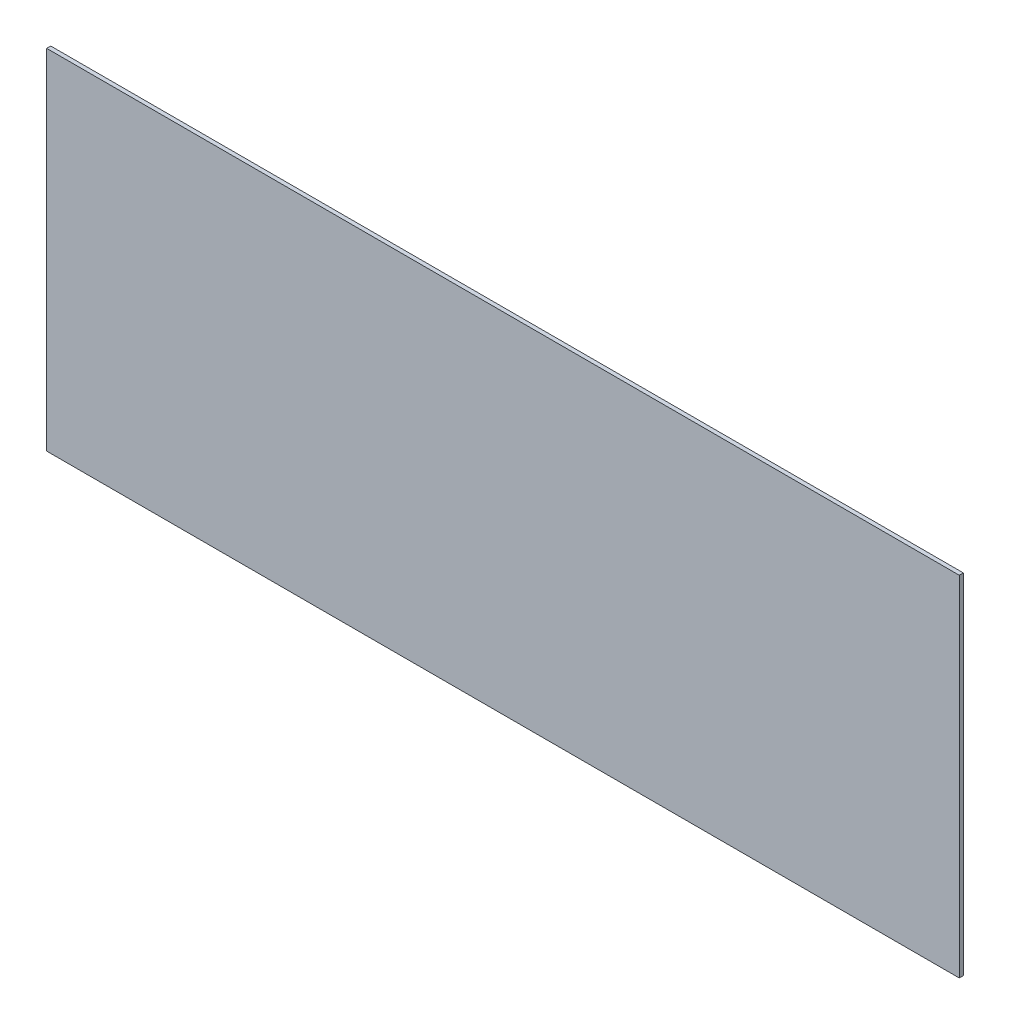
ISO-10303-21;
HEADER;
FILE_DESCRIPTION(('STEP AP214'),'2;1');
FILE_NAME('part.step','',(''),(''),'','','');
FILE_SCHEMA(('AUTOMOTIVE_DESIGN { 1 0 10303 214 1 1 1 1 }'));
ENDSEC;
DATA;
#1=APPLICATION_CONTEXT('core data for automotive mechanical design processes');
#2=APPLICATION_PROTOCOL_DEFINITION('international standard','automotive_design',2000,#1);
#3=PRODUCT_CONTEXT('',#1,'mechanical');
#4=PRODUCT('Part','Part','',(#3));
#5=PRODUCT_RELATED_PRODUCT_CATEGORY('part','',(#4));
#6=PRODUCT_DEFINITION_FORMATION('','',#4);
#7=PRODUCT_DEFINITION_CONTEXT('part definition',#1,'design');
#8=PRODUCT_DEFINITION('design','',#6,#7);
#9=PRODUCT_DEFINITION_SHAPE('','',#8);
#10=(LENGTH_UNIT() NAMED_UNIT(*) SI_UNIT(.MILLI.,.METRE.));
#11=(NAMED_UNIT(*) PLANE_ANGLE_UNIT() SI_UNIT($,.RADIAN.));
#12=(NAMED_UNIT(*) SI_UNIT($,.STERADIAN.) SOLID_ANGLE_UNIT());
#13=UNCERTAINTY_MEASURE_WITH_UNIT(LENGTH_MEASURE(1.E-05),#10,'distance_accuracy_value','');
#14=(GEOMETRIC_REPRESENTATION_CONTEXT(3) GLOBAL_UNCERTAINTY_ASSIGNED_CONTEXT((#13)) GLOBAL_UNIT_ASSIGNED_CONTEXT((#10,
#11,#12)) REPRESENTATION_CONTEXT('',''));
#15=CARTESIAN_POINT('',(0.,0.,0.));
#16=DIRECTION('',(0.,0.,1.));
#17=DIRECTION('',(1.,0.,0.));
#18=AXIS2_PLACEMENT_3D('',#15,#16,#17);
#19=CARTESIAN_POINT('',(225.,86.,2.));
#20=DIRECTION('',(-1.,0.,0.));
#21=DIRECTION('',(0.,0.,1.));
#22=AXIS2_PLACEMENT_3D('',#19,#20,#21);
#23=PLANE('',#22);
#24=DIRECTION('',(0.,1.,0.));
#25=VECTOR('',#24,1.);
#26=CARTESIAN_POINT('',(225.,86.,0.));
#27=LINE('',#26,#25);
#28=CARTESIAN_POINT('',(225.,-86.,0.));
#29=VERTEX_POINT('',#28);
#30=CARTESIAN_POINT('',(225.,86.,0.));
#31=VERTEX_POINT('',#30);
#32=EDGE_CURVE('E112',#29,#31,#27,.T.);
#33=ORIENTED_EDGE('',*,*,#32,.T.);
#34=DIRECTION('',(0.,0.,-1.));
#35=VECTOR('',#34,1.);
#36=CARTESIAN_POINT('',(225.,86.,2.));
#37=LINE('',#36,#35);
#38=CARTESIAN_POINT('',(225.,86.,2.));
#39=VERTEX_POINT('',#38);
#40=EDGE_CURVE('E11',#39,#31,#37,.T.);
#41=ORIENTED_EDGE('',*,*,#40,.F.);
#42=DIRECTION('',(0.,1.,0.));
#43=VECTOR('',#42,1.);
#44=CARTESIAN_POINT('',(225.,86.,2.));
#45=LINE('',#44,#43);
#46=CARTESIAN_POINT('',(225.,-86.,2.));
#47=VERTEX_POINT('',#46);
#48=EDGE_CURVE('E96',#47,#39,#45,.T.);
#49=ORIENTED_EDGE('',*,*,#48,.F.);
#50=DIRECTION('',(0.,0.,-1.));
#51=VECTOR('',#50,1.);
#52=CARTESIAN_POINT('',(225.,-86.,2.));
#53=LINE('',#52,#51);
#54=EDGE_CURVE('E108',#47,#29,#53,.T.);
#55=ORIENTED_EDGE('',*,*,#54,.T.);
#56=EDGE_LOOP('',(#33,#41,#49,#55));
#57=FACE_BOUND('',#56,.T.);
#58=ADVANCED_FACE('F44',(#57),#23,.F.);
#59=CARTESIAN_POINT('',(-225.,86.,2.));
#60=DIRECTION('',(0.,-1.,0.));
#61=DIRECTION('',(0.,0.,-1.));
#62=AXIS2_PLACEMENT_3D('',#59,#60,#61);
#63=PLANE('',#62);
#64=DIRECTION('',(-1.,0.,0.));
#65=VECTOR('',#64,1.);
#66=CARTESIAN_POINT('',(-225.,86.,0.));
#67=LINE('',#66,#65);
#68=CARTESIAN_POINT('',(-225.,86.,0.));
#69=VERTEX_POINT('',#68);
#70=EDGE_CURVE('E101',#31,#69,#67,.T.);
#71=ORIENTED_EDGE('',*,*,#70,.T.);
#72=DIRECTION('',(0.,0.,-1.));
#73=VECTOR('',#72,1.);
#74=CARTESIAN_POINT('',(-225.,86.,2.));
#75=LINE('',#74,#73);
#76=CARTESIAN_POINT('',(-225.,86.,2.));
#77=VERTEX_POINT('',#76);
#78=EDGE_CURVE('E53',#77,#69,#75,.T.);
#79=ORIENTED_EDGE('',*,*,#78,.F.);
#80=DIRECTION('',(-1.,0.,0.));
#81=VECTOR('',#80,1.);
#82=CARTESIAN_POINT('',(-225.,86.,2.));
#83=LINE('',#82,#81);
#84=EDGE_CURVE('E91',#39,#77,#83,.T.);
#85=ORIENTED_EDGE('',*,*,#84,.F.);
#86=ORIENTED_EDGE('',*,*,#40,.T.);
#87=EDGE_LOOP('',(#71,#79,#85,#86));
#88=FACE_BOUND('',#87,.T.);
#89=ADVANCED_FACE('F100',(#88),#63,.F.);
#90=CARTESIAN_POINT('',(-225.,86.,2.));
#91=DIRECTION('',(1.,0.,0.));
#92=DIRECTION('',(0.,0.,-1.));
#93=AXIS2_PLACEMENT_3D('',#90,#91,#92);
#94=PLANE('',#93);
#95=DIRECTION('',(0.,-1.,0.));
#96=VECTOR('',#95,1.);
#97=CARTESIAN_POINT('',(-225.,86.,0.));
#98=LINE('',#97,#96);
#99=CARTESIAN_POINT('',(-225.,-86.,0.));
#100=VERTEX_POINT('',#99);
#101=EDGE_CURVE('E78',#69,#100,#98,.T.);
#102=ORIENTED_EDGE('',*,*,#101,.T.);
#103=DIRECTION('',(0.,0.,-1.));
#104=VECTOR('',#103,1.);
#105=CARTESIAN_POINT('',(-225.,-86.,2.));
#106=LINE('',#105,#104);
#107=CARTESIAN_POINT('',(-225.,-86.,2.));
#108=VERTEX_POINT('',#107);
#109=EDGE_CURVE('E103',#108,#100,#106,.T.);
#110=ORIENTED_EDGE('',*,*,#109,.F.);
#111=DIRECTION('',(0.,-1.,0.));
#112=VECTOR('',#111,1.);
#113=CARTESIAN_POINT('',(-225.,86.,2.));
#114=LINE('',#113,#112);
#115=EDGE_CURVE('E94',#77,#108,#114,.T.);
#116=ORIENTED_EDGE('',*,*,#115,.F.);
#117=ORIENTED_EDGE('',*,*,#78,.T.);
#118=EDGE_LOOP('',(#102,#110,#116,#117));
#119=FACE_BOUND('',#118,.T.);
#120=ADVANCED_FACE('F104',(#119),#94,.F.);
#121=CARTESIAN_POINT('',(-225.,-86.,2.));
#122=DIRECTION('',(0.,1.,0.));
#123=DIRECTION('',(0.,0.,1.));
#124=AXIS2_PLACEMENT_3D('',#121,#122,#123);
#125=PLANE('',#124);
#126=DIRECTION('',(1.,0.,0.));
#127=VECTOR('',#126,1.);
#128=CARTESIAN_POINT('',(-225.,-86.,0.));
#129=LINE('',#128,#127);
#130=EDGE_CURVE('E84',#100,#29,#129,.T.);
#131=ORIENTED_EDGE('',*,*,#130,.T.);
#132=ORIENTED_EDGE('',*,*,#54,.F.);
#133=DIRECTION('',(1.,0.,0.));
#134=VECTOR('',#133,1.);
#135=CARTESIAN_POINT('',(-225.,-86.,2.));
#136=LINE('',#135,#134);
#137=EDGE_CURVE('E61',#108,#47,#136,.T.);
#138=ORIENTED_EDGE('',*,*,#137,.F.);
#139=ORIENTED_EDGE('',*,*,#109,.T.);
#140=EDGE_LOOP('',(#131,#132,#138,#139));
#141=FACE_BOUND('',#140,.T.);
#142=ADVANCED_FACE('F125',(#141),#125,.F.);
#143=CARTESIAN_POINT('',(0.,0.,2.));
#144=DIRECTION('',(0.,0.,1.));
#145=DIRECTION('',(1.,0.,0.));
#146=AXIS2_PLACEMENT_3D('',#143,#144,#145);
#147=PLANE('',#146);
#148=ORIENTED_EDGE('',*,*,#48,.T.);
#149=ORIENTED_EDGE('',*,*,#84,.T.);
#150=ORIENTED_EDGE('',*,*,#115,.T.);
#151=ORIENTED_EDGE('',*,*,#137,.T.);
#152=EDGE_LOOP('',(#148,#149,#150,#151));
#153=FACE_BOUND('',#152,.T.);
#154=ADVANCED_FACE('F92',(#153),#147,.T.);
#155=CARTESIAN_POINT('',(0.,0.,0.));
#156=DIRECTION('',(0.,0.,1.));
#157=DIRECTION('',(1.,0.,0.));
#158=AXIS2_PLACEMENT_3D('',#155,#156,#157);
#159=PLANE('',#158);
#160=ORIENTED_EDGE('',*,*,#32,.F.);
#161=ORIENTED_EDGE('',*,*,#130,.F.);
#162=ORIENTED_EDGE('',*,*,#101,.F.);
#163=ORIENTED_EDGE('',*,*,#70,.F.);
#164=EDGE_LOOP('',(#160,#161,#162,#163));
#165=FACE_BOUND('',#164,.T.);
#166=ADVANCED_FACE('F128',(#165),#159,.F.);
#167=CLOSED_SHELL('',(#58,#89,#120,#142,#154,#166));
#168=MANIFOLD_SOLID_BREP('B2',#167);
#169=ADVANCED_BREP_SHAPE_REPRESENTATION('',(#18,#168),#14);
#170=SHAPE_DEFINITION_REPRESENTATION(#9,#169);
ENDSEC;
END-ISO-10303-21;
